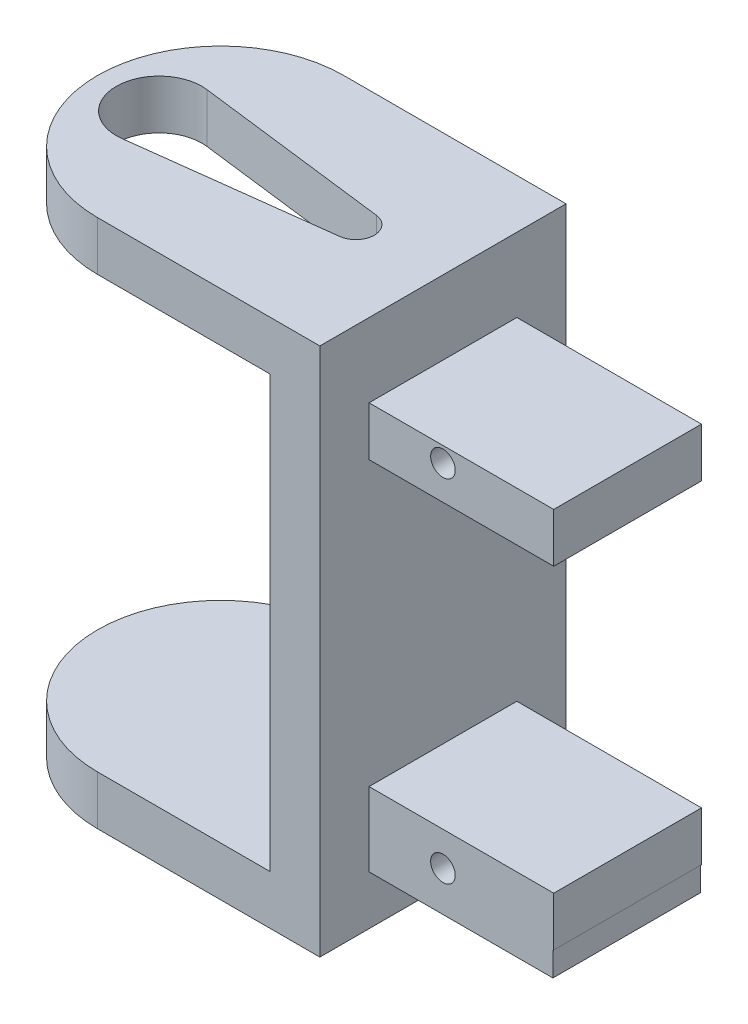
ISO-10303-21;
HEADER;
FILE_DESCRIPTION(('STEP AP214'),'2;1');
FILE_NAME('part.step','',(''),(''),'','','');
FILE_SCHEMA(('AUTOMOTIVE_DESIGN { 1 0 10303 214 1 1 1 1 }'));
ENDSEC;
DATA;
#1=APPLICATION_CONTEXT('core data for automotive mechanical design processes');
#2=APPLICATION_PROTOCOL_DEFINITION('international standard','automotive_design',2000,#1);
#3=PRODUCT_CONTEXT('',#1,'mechanical');
#4=PRODUCT('Part','Part','',(#3));
#5=PRODUCT_RELATED_PRODUCT_CATEGORY('part','',(#4));
#6=PRODUCT_DEFINITION_FORMATION('','',#4);
#7=PRODUCT_DEFINITION_CONTEXT('part definition',#1,'design');
#8=PRODUCT_DEFINITION('design','',#6,#7);
#9=PRODUCT_DEFINITION_SHAPE('','',#8);
#10=(LENGTH_UNIT() NAMED_UNIT(*) SI_UNIT(.MILLI.,.METRE.));
#11=(NAMED_UNIT(*) PLANE_ANGLE_UNIT() SI_UNIT($,.RADIAN.));
#12=(NAMED_UNIT(*) SI_UNIT($,.STERADIAN.) SOLID_ANGLE_UNIT());
#13=UNCERTAINTY_MEASURE_WITH_UNIT(LENGTH_MEASURE(1.E-05),#10,'distance_accuracy_value','');
#14=(GEOMETRIC_REPRESENTATION_CONTEXT(3) GLOBAL_UNCERTAINTY_ASSIGNED_CONTEXT((#13)) GLOBAL_UNIT_ASSIGNED_CONTEXT((#10,
#11,#12)) REPRESENTATION_CONTEXT('',''));
#15=CARTESIAN_POINT('',(0.,0.,0.));
#16=DIRECTION('',(0.,0.,1.));
#17=DIRECTION('',(1.,0.,0.));
#18=AXIS2_PLACEMENT_3D('',#15,#16,#17);
#19=CARTESIAN_POINT('',(28.0620864376926,0.,0.));
#20=DIRECTION('',(1.,0.,0.));
#21=DIRECTION('',(0.,1.,0.));
#22=AXIS2_PLACEMENT_3D('',#19,#20,#21);
#23=PLANE('',#22);
#24=DIRECTION('',(0.,0.,-1.));
#25=VECTOR('',#24,1.);
#26=CARTESIAN_POINT('',(28.0620864376926,-5.99999999999999,0.));
#27=LINE('',#26,#25);
#28=CARTESIAN_POINT('',(28.0620864376926,-5.99999999999999,16.0016515585464));
#29=VERTEX_POINT('',#28);
#30=CARTESIAN_POINT('',(28.0620864376926,-5.99999999999999,3.99834844145359));
#31=VERTEX_POINT('',#30);
#32=EDGE_CURVE('E239',#29,#31,#27,.T.);
#33=ORIENTED_EDGE('',*,*,#32,.T.);
#34=DIRECTION('',(0.,1.,0.));
#35=VECTOR('',#34,1.);
#36=CARTESIAN_POINT('',(28.0620864376926,0.,3.99834844145359));
#37=LINE('',#36,#35);
#38=CARTESIAN_POINT('',(28.0620864376926,-9.99999999999999,3.99834844145359));
#39=VERTEX_POINT('',#38);
#40=EDGE_CURVE('E244',#39,#31,#37,.T.);
#41=ORIENTED_EDGE('',*,*,#40,.F.);
#42=DIRECTION('',(0.,0.,-1.));
#43=VECTOR('',#42,1.);
#44=CARTESIAN_POINT('',(28.0620864376926,-9.99999999999999,0.));
#45=LINE('',#44,#43);
#46=CARTESIAN_POINT('',(28.0620864376926,-9.99999999999999,16.0016515585464));
#47=VERTEX_POINT('',#46);
#48=EDGE_CURVE('E257',#47,#39,#45,.T.);
#49=ORIENTED_EDGE('',*,*,#48,.F.);
#50=DIRECTION('',(0.,1.,0.));
#51=VECTOR('',#50,1.);
#52=CARTESIAN_POINT('',(28.0620864376926,0.,16.0016515585464));
#53=LINE('',#52,#51);
#54=EDGE_CURVE('E254',#47,#29,#53,.T.);
#55=ORIENTED_EDGE('',*,*,#54,.T.);
#56=EDGE_LOOP('',(#33,#41,#49,#55));
#57=FACE_BOUND('',#56,.T.);
#58=DIRECTION('',(0.,-1.,0.));
#59=VECTOR('',#58,1.);
#60=CARTESIAN_POINT('',(28.0620864376926,0.,20.));
#61=LINE('',#60,#59);
#62=CARTESIAN_POINT('',(28.0620864376926,0.,20.));
#63=VERTEX_POINT('',#62);
#64=CARTESIAN_POINT('',(28.0620864376926,-43.,20.));
#65=VERTEX_POINT('',#64);
#66=EDGE_CURVE('E291',#63,#65,#61,.T.);
#67=ORIENTED_EDGE('',*,*,#66,.T.);
#68=DIRECTION('',(0.,0.,-1.));
#69=VECTOR('',#68,1.);
#70=CARTESIAN_POINT('',(28.0620864376926,-43.,0.));
#71=LINE('',#70,#69);
#72=CARTESIAN_POINT('',(28.0620864376926,-43.,0.));
#73=VERTEX_POINT('',#72);
#74=EDGE_CURVE('E344',#65,#73,#71,.T.);
#75=ORIENTED_EDGE('',*,*,#74,.T.);
#76=DIRECTION('',(0.,1.,0.));
#77=VECTOR('',#76,1.);
#78=CARTESIAN_POINT('',(28.0620864376926,0.,0.));
#79=LINE('',#78,#77);
#80=CARTESIAN_POINT('',(28.0620864376926,0.,0.));
#81=VERTEX_POINT('',#80);
#82=EDGE_CURVE('E294',#73,#81,#79,.T.);
#83=ORIENTED_EDGE('',*,*,#82,.T.);
#84=DIRECTION('',(0.,0.,1.));
#85=VECTOR('',#84,1.);
#86=CARTESIAN_POINT('',(28.0620864376926,0.,20.));
#87=LINE('',#86,#85);
#88=EDGE_CURVE('E297',#81,#63,#87,.T.);
#89=ORIENTED_EDGE('',*,*,#88,.T.);
#90=EDGE_LOOP('',(#67,#75,#83,#89));
#91=FACE_BOUND('',#90,.T.);
#92=DIRECTION('',(0.,0.,-1.));
#93=VECTOR('',#92,1.);
#94=CARTESIAN_POINT('',(28.0620864376926,-39.,16.0016515585464));
#95=LINE('',#94,#93);
#96=CARTESIAN_POINT('',(28.0620864376926,-39.,16.0016515585464));
#97=VERTEX_POINT('',#96);
#98=CARTESIAN_POINT('',(28.0620864376926,-39.,3.99834844145358));
#99=VERTEX_POINT('',#98);
#100=EDGE_CURVE('E197',#97,#99,#95,.T.);
#101=ORIENTED_EDGE('',*,*,#100,.F.);
#102=DIRECTION('',(0.,-1.,0.));
#103=VECTOR('',#102,1.);
#104=CARTESIAN_POINT('',(28.0620864376926,0.,16.0016515585464));
#105=LINE('',#104,#103);
#106=CARTESIAN_POINT('',(28.0620864376926,-33.,16.0016515585464));
#107=VERTEX_POINT('',#106);
#108=EDGE_CURVE('E49',#107,#97,#105,.T.);
#109=ORIENTED_EDGE('',*,*,#108,.F.);
#110=DIRECTION('',(0.,0.,-1.));
#111=VECTOR('',#110,1.);
#112=CARTESIAN_POINT('',(28.0620864376926,-33.,0.));
#113=LINE('',#112,#111);
#114=CARTESIAN_POINT('',(28.0620864376926,-33.,3.99834844145358));
#115=VERTEX_POINT('',#114);
#116=EDGE_CURVE('E192',#107,#115,#113,.T.);
#117=ORIENTED_EDGE('',*,*,#116,.T.);
#118=DIRECTION('',(0.,-1.,0.));
#119=VECTOR('',#118,1.);
#120=CARTESIAN_POINT('',(28.0620864376926,0.,3.99834844145358));
#121=LINE('',#120,#119);
#122=EDGE_CURVE('E191',#115,#99,#121,.T.);
#123=ORIENTED_EDGE('',*,*,#122,.T.);
#124=EDGE_LOOP('',(#101,#109,#117,#123));
#125=FACE_BOUND('',#124,.T.);
#126=ADVANCED_FACE('F34',(#57,#91,#125),#23,.T.);
#127=CARTESIAN_POINT('',(43.0620864376926,-37.,0.));
#128=DIRECTION('',(0.,1.,0.));
#129=DIRECTION('',(-1.,0.,0.));
#130=AXIS2_PLACEMENT_3D('',#127,#128,#129);
#131=PLANE('',#130);
#132=DIRECTION('',(0.,0.,1.));
#133=VECTOR('',#132,1.);
#134=CARTESIAN_POINT('',(42.9967384028542,-37.,16.0016515585464));
#135=LINE('',#134,#133);
#136=CARTESIAN_POINT('',(42.9967384028542,-37.,3.99834844145358));
#137=VERTEX_POINT('',#136);
#138=CARTESIAN_POINT('',(42.9967384028542,-37.,16.0016515585464));
#139=VERTEX_POINT('',#138);
#140=EDGE_CURVE('E202',#137,#139,#135,.T.);
#141=ORIENTED_EDGE('',*,*,#140,.F.);
#142=DIRECTION('',(-1.,0.,0.));
#143=VECTOR('',#142,1.);
#144=CARTESIAN_POINT('',(43.0620864376926,-37.,3.99834844145358));
#145=LINE('',#144,#143);
#146=CARTESIAN_POINT('',(43.0620864376926,-37.,3.99834844145358));
#147=VERTEX_POINT('',#146);
#148=EDGE_CURVE('E232',#147,#137,#145,.T.);
#149=ORIENTED_EDGE('',*,*,#148,.F.);
#150=DIRECTION('',(0.,0.,-1.));
#151=VECTOR('',#150,1.);
#152=CARTESIAN_POINT('',(43.0620864376926,-37.,0.));
#153=LINE('',#152,#151);
#154=CARTESIAN_POINT('',(43.0620864376926,-37.,16.0016515585464));
#155=VERTEX_POINT('',#154);
#156=EDGE_CURVE('E222',#155,#147,#153,.T.);
#157=ORIENTED_EDGE('',*,*,#156,.F.);
#158=DIRECTION('',(-1.,0.,0.));
#159=VECTOR('',#158,1.);
#160=CARTESIAN_POINT('',(43.0620864376926,-37.,16.0016515585464));
#161=LINE('',#160,#159);
#162=EDGE_CURVE('E235',#155,#139,#161,.T.);
#163=ORIENTED_EDGE('',*,*,#162,.T.);
#164=EDGE_LOOP('',(#141,#149,#157,#163));
#165=FACE_BOUND('',#164,.T.);
#166=ADVANCED_FACE('F396',(#165),#131,.F.);
#167=CARTESIAN_POINT('',(0.,-4.,20.));
#168=DIRECTION('',(0.,1.,0.));
#169=DIRECTION('',(0.,0.,1.));
#170=AXIS2_PLACEMENT_3D('',#167,#168,#169);
#171=PLANE('',#170);
#172=CARTESIAN_POINT('',(5.,-4.,10.));
#173=DIRECTION('',(0.,1.,0.));
#174=DIRECTION('',(0.,0.,1.));
#175=AXIS2_PLACEMENT_3D('',#172,#173,#174);
#176=CIRCLE('',#175,3.475);
#177=CARTESIAN_POINT('',(5.42934782608696,-4.,6.55162568095712));
#178=VERTEX_POINT('',#177);
#179=CARTESIAN_POINT('',(5.42934782608696,-4.,13.4483743190429));
#180=VERTEX_POINT('',#179);
#181=EDGE_CURVE('E322',#178,#180,#176,.T.);
#182=ORIENTED_EDGE('',*,*,#181,.T.);
#183=DIRECTION('',(0.992337933537518,0.,-0.123553331248045));
#184=VECTOR('',#183,1.);
#185=CARTESIAN_POINT('',(-0.720391619724212,-4.,14.2140618627296));
#186=LINE('',#185,#184);
#187=CARTESIAN_POINT('',(21.1703299968721,-4.,11.4885069003063));
#188=VERTEX_POINT('',#187);
#189=EDGE_CURVE('E325',#180,#188,#186,.T.);
#190=ORIENTED_EDGE('',*,*,#189,.T.);
#191=CARTESIAN_POINT('',(20.985,-4.,10.));
#192=DIRECTION('',(0.,1.,0.));
#193=DIRECTION('',(-1.,0.,0.));
#194=AXIS2_PLACEMENT_3D('',#191,#192,#193);
#195=CIRCLE('',#194,1.5);
#196=CARTESIAN_POINT('',(21.1703299968721,-4.,8.51149309969372));
#197=VERTEX_POINT('',#196);
#198=EDGE_CURVE('E333',#197,#188,#195,.F.);
#199=ORIENTED_EDGE('',*,*,#198,.F.);
#200=DIRECTION('',(0.992337933537518,0.,0.123553331248045));
#201=VECTOR('',#200,1.);
#202=CARTESIAN_POINT('',(1.73174152852302,-4.,6.09124665052021));
#203=LINE('',#202,#201);
#204=EDGE_CURVE('E315',#178,#197,#203,.T.);
#205=ORIENTED_EDGE('',*,*,#204,.F.);
#206=EDGE_LOOP('',(#182,#190,#199,#205));
#207=FACE_BOUND('',#206,.T.);
#208=DIRECTION('',(1.,0.,0.));
#209=VECTOR('',#208,1.);
#210=CARTESIAN_POINT('',(0.,-4.,20.));
#211=LINE('',#210,#209);
#212=CARTESIAN_POINT('',(10.0000000000001,-4.00000000000002,20.));
#213=VERTEX_POINT('',#212);
#214=CARTESIAN_POINT('',(24.,-4.,20.));
#215=VERTEX_POINT('',#214);
#216=EDGE_CURVE('E328',#213,#215,#211,.T.);
#217=ORIENTED_EDGE('',*,*,#216,.F.);
#218=CARTESIAN_POINT('',(10.,-4.,10.));
#219=DIRECTION('',(0.,1.,0.));
#220=DIRECTION('',(0.,0.,1.));
#221=AXIS2_PLACEMENT_3D('',#218,#219,#220);
#222=CIRCLE('',#221,10.0000000000001);
#223=CARTESIAN_POINT('',(10.,-4.00000000000001,0.));
#224=VERTEX_POINT('',#223);
#225=EDGE_CURVE('E274',#224,#213,#222,.T.);
#226=ORIENTED_EDGE('',*,*,#225,.F.);
#227=DIRECTION('',(1.,0.,0.));
#228=VECTOR('',#227,1.);
#229=CARTESIAN_POINT('',(0.,-4.,0.));
#230=LINE('',#229,#228);
#231=CARTESIAN_POINT('',(24.,-4.,0.));
#232=VERTEX_POINT('',#231);
#233=EDGE_CURVE('E327',#224,#232,#230,.T.);
#234=ORIENTED_EDGE('',*,*,#233,.T.);
#235=DIRECTION('',(0.,0.,1.));
#236=VECTOR('',#235,1.);
#237=CARTESIAN_POINT('',(24.,-4.,-3.));
#238=LINE('',#237,#236);
#239=EDGE_CURVE('E288',#232,#215,#238,.T.);
#240=ORIENTED_EDGE('',*,*,#239,.T.);
#241=EDGE_LOOP('',(#217,#226,#234,#240));
#242=FACE_BOUND('',#241,.T.);
#243=ADVANCED_FACE('F36',(#207,#242),#171,.F.);
#244=CARTESIAN_POINT('',(0.,0.,20.));
#245=DIRECTION('',(0.,1.,0.));
#246=DIRECTION('',(0.,0.,1.));
#247=AXIS2_PLACEMENT_3D('',#244,#245,#246);
#248=PLANE('',#247);
#249=DIRECTION('',(0.992337933537518,0.,-0.123553331248045));
#250=VECTOR('',#249,1.);
#251=CARTESIAN_POINT('',(1.73174152852302,0.,13.9087533494798));
#252=LINE('',#251,#250);
#253=CARTESIAN_POINT('',(5.42934782608696,0.,13.4483743190429));
#254=VERTEX_POINT('',#253);
#255=CARTESIAN_POINT('',(21.1703299968721,0.,11.4885069003063));
#256=VERTEX_POINT('',#255);
#257=EDGE_CURVE('E300',#254,#256,#252,.T.);
#258=ORIENTED_EDGE('',*,*,#257,.F.);
#259=CARTESIAN_POINT('',(5.,0.,10.));
#260=DIRECTION('',(0.,1.,0.));
#261=DIRECTION('',(0.,0.,1.));
#262=AXIS2_PLACEMENT_3D('',#259,#260,#261);
#263=CIRCLE('',#262,3.475);
#264=CARTESIAN_POINT('',(5.42934782608696,0.,6.55162568095712));
#265=VERTEX_POINT('',#264);
#266=EDGE_CURVE('E309',#265,#254,#263,.T.);
#267=ORIENTED_EDGE('',*,*,#266,.F.);
#268=DIRECTION('',(0.992337933537518,0.,0.123553331248045));
#269=VECTOR('',#268,1.);
#270=CARTESIAN_POINT('',(-0.720391619724212,0.,5.78593813727043));
#271=LINE('',#270,#269);
#272=CARTESIAN_POINT('',(21.1703299968721,0.,8.51149309969372));
#273=VERTEX_POINT('',#272);
#274=EDGE_CURVE('E306',#265,#273,#271,.T.);
#275=ORIENTED_EDGE('',*,*,#274,.T.);
#276=CARTESIAN_POINT('',(20.985,0.,10.));
#277=DIRECTION('',(0.,1.,0.));
#278=DIRECTION('',(0.,0.,1.));
#279=AXIS2_PLACEMENT_3D('',#276,#277,#278);
#280=CIRCLE('',#279,1.5);
#281=EDGE_CURVE('E303',#256,#273,#280,.T.);
#282=ORIENTED_EDGE('',*,*,#281,.F.);
#283=EDGE_LOOP('',(#258,#267,#275,#282));
#284=FACE_BOUND('',#283,.T.);
#285=CARTESIAN_POINT('',(10.,0.,10.));
#286=DIRECTION('',(0.,1.,0.));
#287=DIRECTION('',(0.,0.,1.));
#288=AXIS2_PLACEMENT_3D('',#285,#286,#287);
#289=CIRCLE('',#288,10.0000000000001);
#290=CARTESIAN_POINT('',(10.,0.,0.));
#291=VERTEX_POINT('',#290);
#292=CARTESIAN_POINT('',(10.0000000000001,0.,20.));
#293=VERTEX_POINT('',#292);
#294=EDGE_CURVE('E266',#291,#293,#289,.T.);
#295=ORIENTED_EDGE('',*,*,#294,.T.);
#296=DIRECTION('',(1.,0.,0.));
#297=VECTOR('',#296,1.);
#298=CARTESIAN_POINT('',(0.,0.,20.));
#299=LINE('',#298,#297);
#300=EDGE_CURVE('E330',#293,#63,#299,.T.);
#301=ORIENTED_EDGE('',*,*,#300,.T.);
#302=ORIENTED_EDGE('',*,*,#88,.F.);
#303=DIRECTION('',(1.,0.,0.));
#304=VECTOR('',#303,1.);
#305=CARTESIAN_POINT('',(0.,0.,0.));
#306=LINE('',#305,#304);
#307=EDGE_CURVE('E331',#291,#81,#306,.T.);
#308=ORIENTED_EDGE('',*,*,#307,.F.);
#309=EDGE_LOOP('',(#295,#301,#302,#308));
#310=FACE_BOUND('',#309,.T.);
#311=ADVANCED_FACE('F364',(#284,#310),#248,.T.);
#312=CARTESIAN_POINT('',(0.,-39.,0.));
#313=DIRECTION('',(0.,-1.,0.));
#314=DIRECTION('',(0.,0.,-1.));
#315=AXIS2_PLACEMENT_3D('',#312,#313,#314);
#316=PLANE('',#315);
#317=CARTESIAN_POINT('',(10.,-39.,10.));
#318=DIRECTION('',(0.,-1.,0.));
#319=DIRECTION('',(0.,0.,-1.));
#320=AXIS2_PLACEMENT_3D('',#317,#318,#319);
#321=CIRCLE('',#320,10.0000000000001);
#322=CARTESIAN_POINT('',(10.0000000000001,-39.,20.));
#323=VERTEX_POINT('',#322);
#324=CARTESIAN_POINT('',(10.,-39.,0.));
#325=VERTEX_POINT('',#324);
#326=EDGE_CURVE('E272',#323,#325,#321,.T.);
#327=ORIENTED_EDGE('',*,*,#326,.F.);
#328=DIRECTION('',(1.,0.,0.));
#329=VECTOR('',#328,1.);
#330=CARTESIAN_POINT('',(0.,-39.,20.));
#331=LINE('',#330,#329);
#332=CARTESIAN_POINT('',(24.,-39.,20.));
#333=VERTEX_POINT('',#332);
#334=EDGE_CURVE('E283',#323,#333,#331,.T.);
#335=ORIENTED_EDGE('',*,*,#334,.T.);
#336=DIRECTION('',(0.,0.,-1.));
#337=VECTOR('',#336,1.);
#338=CARTESIAN_POINT('',(24.,-39.,-3.));
#339=LINE('',#338,#337);
#340=CARTESIAN_POINT('',(24.,-39.,0.));
#341=VERTEX_POINT('',#340);
#342=EDGE_CURVE('E341',#333,#341,#339,.T.);
#343=ORIENTED_EDGE('',*,*,#342,.T.);
#344=DIRECTION('',(-1.,0.,0.));
#345=VECTOR('',#344,1.);
#346=CARTESIAN_POINT('',(0.,-39.,0.));
#347=LINE('',#346,#345);
#348=EDGE_CURVE('E280',#341,#325,#347,.T.);
#349=ORIENTED_EDGE('',*,*,#348,.T.);
#350=EDGE_LOOP('',(#327,#335,#343,#349));
#351=FACE_BOUND('',#350,.T.);
#352=ADVANCED_FACE('F382',(#351),#316,.F.);
#353=CARTESIAN_POINT('',(0.,-43.,-30.));
#354=DIRECTION('',(0.,-1.,0.));
#355=DIRECTION('',(0.,0.,-1.));
#356=AXIS2_PLACEMENT_3D('',#353,#354,#355);
#357=PLANE('',#356);
#358=DIRECTION('',(1.,0.,0.));
#359=VECTOR('',#358,1.);
#360=CARTESIAN_POINT('',(0.,-43.,20.));
#361=LINE('',#360,#359);
#362=CARTESIAN_POINT('',(10.0000000000001,-43.,20.));
#363=VERTEX_POINT('',#362);
#364=EDGE_CURVE('E276',#363,#65,#361,.T.);
#365=ORIENTED_EDGE('',*,*,#364,.F.);
#366=CARTESIAN_POINT('',(10.,-43.,10.));
#367=DIRECTION('',(0.,-1.,0.));
#368=DIRECTION('',(0.,0.,-1.));
#369=AXIS2_PLACEMENT_3D('',#366,#367,#368);
#370=CIRCLE('',#369,10.0000000000001);
#371=CARTESIAN_POINT('',(10.,-43.,0.));
#372=VERTEX_POINT('',#371);
#373=EDGE_CURVE('E346',#363,#372,#370,.T.);
#374=ORIENTED_EDGE('',*,*,#373,.T.);
#375=DIRECTION('',(1.,0.,0.));
#376=VECTOR('',#375,1.);
#377=CARTESIAN_POINT('',(0.,-43.,0.));
#378=LINE('',#377,#376);
#379=EDGE_CURVE('E278',#372,#73,#378,.T.);
#380=ORIENTED_EDGE('',*,*,#379,.T.);
#381=ORIENTED_EDGE('',*,*,#74,.F.);
#382=EDGE_LOOP('',(#365,#374,#380,#381));
#383=FACE_BOUND('',#382,.T.);
#384=ADVANCED_FACE('F385',(#383),#357,.T.);
#385=CARTESIAN_POINT('',(0.,0.,20.));
#386=DIRECTION('',(0.,0.,1.));
#387=DIRECTION('',(1.,0.,0.));
#388=AXIS2_PLACEMENT_3D('',#385,#386,#387);
#389=PLANE('',#388);
#390=DIRECTION('',(0.,1.,0.));
#391=VECTOR('',#390,1.);
#392=CARTESIAN_POINT('',(10.,-50.,20.));
#393=LINE('',#392,#391);
#394=EDGE_CURVE('E11',#363,#323,#393,.T.);
#395=ORIENTED_EDGE('',*,*,#394,.F.);
#396=ORIENTED_EDGE('',*,*,#364,.T.);
#397=ORIENTED_EDGE('',*,*,#66,.F.);
#398=ORIENTED_EDGE('',*,*,#300,.F.);
#399=EDGE_CURVE('E38',#213,#293,#393,.T.);
#400=ORIENTED_EDGE('',*,*,#399,.F.);
#401=ORIENTED_EDGE('',*,*,#216,.T.);
#402=DIRECTION('',(0.,1.,0.));
#403=VECTOR('',#402,1.);
#404=CARTESIAN_POINT('',(24.,-4.,20.));
#405=LINE('',#404,#403);
#406=EDGE_CURVE('E285',#333,#215,#405,.T.);
#407=ORIENTED_EDGE('',*,*,#406,.F.);
#408=ORIENTED_EDGE('',*,*,#334,.F.);
#409=EDGE_LOOP('',(#395,#396,#397,#398,#400,#401,#407,#408));
#410=FACE_BOUND('',#409,.T.);
#411=ADVANCED_FACE('F361',(#410),#389,.T.);
#412=CARTESIAN_POINT('',(0.,0.,0.));
#413=DIRECTION('',(0.,0.,1.));
#414=DIRECTION('',(1.,0.,0.));
#415=AXIS2_PLACEMENT_3D('',#412,#413,#414);
#416=PLANE('',#415);
#417=ORIENTED_EDGE('',*,*,#379,.F.);
#418=DIRECTION('',(0.,1.,0.));
#419=VECTOR('',#418,1.);
#420=CARTESIAN_POINT('',(10.,-50.,0.));
#421=LINE('',#420,#419);
#422=EDGE_CURVE('E271',#372,#325,#421,.T.);
#423=ORIENTED_EDGE('',*,*,#422,.T.);
#424=ORIENTED_EDGE('',*,*,#348,.F.);
#425=DIRECTION('',(0.,1.,0.));
#426=VECTOR('',#425,1.);
#427=CARTESIAN_POINT('',(24.,0.,0.));
#428=LINE('',#427,#426);
#429=EDGE_CURVE('E338',#341,#232,#428,.T.);
#430=ORIENTED_EDGE('',*,*,#429,.T.);
#431=ORIENTED_EDGE('',*,*,#233,.F.);
#432=EDGE_CURVE('E268',#224,#291,#421,.T.);
#433=ORIENTED_EDGE('',*,*,#432,.T.);
#434=ORIENTED_EDGE('',*,*,#307,.T.);
#435=ORIENTED_EDGE('',*,*,#82,.F.);
#436=EDGE_LOOP('',(#417,#423,#424,#430,#431,#433,#434,#435));
#437=FACE_BOUND('',#436,.T.);
#438=ADVANCED_FACE('F370',(#437),#416,.F.);
#439=CARTESIAN_POINT('',(24.,-4.,-3.));
#440=DIRECTION('',(1.,0.,0.));
#441=DIRECTION('',(0.,1.,0.));
#442=AXIS2_PLACEMENT_3D('',#439,#440,#441);
#443=PLANE('',#442);
#444=ORIENTED_EDGE('',*,*,#342,.F.);
#445=ORIENTED_EDGE('',*,*,#406,.T.);
#446=ORIENTED_EDGE('',*,*,#239,.F.);
#447=ORIENTED_EDGE('',*,*,#429,.F.);
#448=EDGE_LOOP('',(#444,#445,#446,#447));
#449=FACE_BOUND('',#448,.T.);
#450=ADVANCED_FACE('F379',(#449),#443,.F.);
#451=CARTESIAN_POINT('',(1.73174152852302,-20.,13.9087533494798));
#452=DIRECTION('',(0.123553331248045,0.,0.992337933537518));
#453=DIRECTION('',(0.992337933537518,0.,-0.123553331248045));
#454=AXIS2_PLACEMENT_3D('',#451,#452,#453);
#455=PLANE('',#454);
#456=DIRECTION('',(0.,1.,0.));
#457=VECTOR('',#456,1.);
#458=CARTESIAN_POINT('',(21.1703299968721,-20.,11.4885069003063));
#459=LINE('',#458,#457);
#460=EDGE_CURVE('E312',#188,#256,#459,.T.);
#461=ORIENTED_EDGE('',*,*,#460,.F.);
#462=ORIENTED_EDGE('',*,*,#189,.F.);
#463=DIRECTION('',(0.,1.,0.));
#464=VECTOR('',#463,1.);
#465=CARTESIAN_POINT('',(5.42934782608696,-20.,13.4483743190429));
#466=LINE('',#465,#464);
#467=EDGE_CURVE('E313',#180,#254,#466,.T.);
#468=ORIENTED_EDGE('',*,*,#467,.T.);
#469=ORIENTED_EDGE('',*,*,#257,.T.);
#470=EDGE_LOOP('',(#461,#462,#468,#469));
#471=FACE_BOUND('',#470,.T.);
#472=ADVANCED_FACE('F410',(#471),#455,.F.);
#473=CARTESIAN_POINT('',(5.,-20.,10.));
#474=DIRECTION('',(0.,1.,0.));
#475=DIRECTION('',(0.,0.,1.));
#476=AXIS2_PLACEMENT_3D('',#473,#474,#475);
#477=CYLINDRICAL_SURFACE('',#476,3.475);
#478=DIRECTION('',(0.,1.,0.));
#479=VECTOR('',#478,1.);
#480=CARTESIAN_POINT('',(5.42934782608696,-20.,6.55162568095712));
#481=LINE('',#480,#479);
#482=EDGE_CURVE('E316',#178,#265,#481,.T.);
#483=ORIENTED_EDGE('',*,*,#482,.T.);
#484=ORIENTED_EDGE('',*,*,#266,.T.);
#485=ORIENTED_EDGE('',*,*,#467,.F.);
#486=ORIENTED_EDGE('',*,*,#181,.F.);
#487=EDGE_LOOP('',(#483,#484,#485,#486));
#488=FACE_BOUND('',#487,.T.);
#489=ADVANCED_FACE('F406',(#488),#477,.F.);
#490=CARTESIAN_POINT('',(-0.720391619724212,-20.,5.78593813727043));
#491=DIRECTION('',(-0.123553331248045,0.,0.992337933537518));
#492=DIRECTION('',(0.992337933537518,0.,0.123553331248045));
#493=AXIS2_PLACEMENT_3D('',#490,#491,#492);
#494=PLANE('',#493);
#495=ORIENTED_EDGE('',*,*,#204,.T.);
#496=DIRECTION('',(0.,1.,0.));
#497=VECTOR('',#496,1.);
#498=CARTESIAN_POINT('',(21.1703299968721,-20.,8.51149309969372));
#499=LINE('',#498,#497);
#500=EDGE_CURVE('E318',#197,#273,#499,.T.);
#501=ORIENTED_EDGE('',*,*,#500,.T.);
#502=ORIENTED_EDGE('',*,*,#274,.F.);
#503=ORIENTED_EDGE('',*,*,#482,.F.);
#504=EDGE_LOOP('',(#495,#501,#502,#503));
#505=FACE_BOUND('',#504,.T.);
#506=ADVANCED_FACE('F409',(#505),#494,.T.);
#507=CARTESIAN_POINT('',(20.985,-20.,10.));
#508=DIRECTION('',(0.,1.,0.));
#509=DIRECTION('',(0.,0.,1.));
#510=AXIS2_PLACEMENT_3D('',#507,#508,#509);
#511=CYLINDRICAL_SURFACE('',#510,1.5);
#512=ORIENTED_EDGE('',*,*,#500,.F.);
#513=ORIENTED_EDGE('',*,*,#198,.T.);
#514=ORIENTED_EDGE('',*,*,#460,.T.);
#515=ORIENTED_EDGE('',*,*,#281,.T.);
#516=EDGE_LOOP('',(#512,#513,#514,#515));
#517=FACE_BOUND('',#516,.T.);
#518=ADVANCED_FACE('F414',(#517),#511,.F.);
#519=CARTESIAN_POINT('',(10.,-50.,10.));
#520=DIRECTION('',(0.,1.,0.));
#521=DIRECTION('',(0.,0.,1.));
#522=AXIS2_PLACEMENT_3D('',#519,#520,#521);
#523=CYLINDRICAL_SURFACE('',#522,10.0000000000001);
#524=ORIENTED_EDGE('',*,*,#326,.T.);
#525=ORIENTED_EDGE('',*,*,#422,.F.);
#526=ORIENTED_EDGE('',*,*,#373,.F.);
#527=ORIENTED_EDGE('',*,*,#394,.T.);
#528=EDGE_LOOP('',(#524,#525,#526,#527));
#529=FACE_BOUND('',#528,.T.);
#530=ADVANCED_FACE('F384',(#529),#523,.T.);
#531=ORIENTED_EDGE('',*,*,#225,.T.);
#532=ORIENTED_EDGE('',*,*,#399,.T.);
#533=ORIENTED_EDGE('',*,*,#294,.F.);
#534=ORIENTED_EDGE('',*,*,#432,.F.);
#535=EDGE_LOOP('',(#531,#532,#533,#534));
#536=FACE_BOUND('',#535,.T.);
#537=ADVANCED_FACE('F355',(#536),#523,.T.);
#538=CARTESIAN_POINT('',(43.0620864376926,-5.99999999999999,0.));
#539=DIRECTION('',(0.,1.,0.));
#540=DIRECTION('',(-1.,0.,0.));
#541=AXIS2_PLACEMENT_3D('',#538,#539,#540);
#542=PLANE('',#541);
#543=ORIENTED_EDGE('',*,*,#32,.F.);
#544=DIRECTION('',(-1.,0.,0.));
#545=VECTOR('',#544,1.);
#546=CARTESIAN_POINT('',(43.0620864376926,-5.99999999999999,16.0016515585464));
#547=LINE('',#546,#545);
#548=CARTESIAN_POINT('',(43.0620864376926,-5.99999999999999,16.0016515585464));
#549=VERTEX_POINT('',#548);
#550=EDGE_CURVE('E264',#549,#29,#547,.T.);
#551=ORIENTED_EDGE('',*,*,#550,.F.);
#552=DIRECTION('',(0.,0.,-1.));
#553=VECTOR('',#552,1.);
#554=CARTESIAN_POINT('',(43.0620864376926,-5.99999999999999,0.));
#555=LINE('',#554,#553);
#556=CARTESIAN_POINT('',(43.0620864376926,-5.99999999999999,3.99834844145359));
#557=VERTEX_POINT('',#556);
#558=EDGE_CURVE('E240',#549,#557,#555,.T.);
#559=ORIENTED_EDGE('',*,*,#558,.T.);
#560=DIRECTION('',(-1.,0.,0.));
#561=VECTOR('',#560,1.);
#562=CARTESIAN_POINT('',(43.0620864376926,-5.99999999999999,3.99834844145359));
#563=LINE('',#562,#561);
#564=EDGE_CURVE('E251',#557,#31,#563,.T.);
#565=ORIENTED_EDGE('',*,*,#564,.T.);
#566=EDGE_LOOP('',(#543,#551,#559,#565));
#567=FACE_BOUND('',#566,.T.);
#568=ADVANCED_FACE('F497',(#567),#542,.T.);
#569=CARTESIAN_POINT('',(43.0620864376926,0.,16.0016515585464));
#570=DIRECTION('',(0.,0.,1.));
#571=DIRECTION('',(1.,0.,0.));
#572=AXIS2_PLACEMENT_3D('',#569,#570,#571);
#573=PLANE('',#572);
#574=CARTESIAN_POINT('',(34.0620864376926,-7.25,16.0016515585464));
#575=DIRECTION('',(0.,0.,1.));
#576=DIRECTION('',(1.,0.,0.));
#577=AXIS2_PLACEMENT_3D('',#574,#575,#576);
#578=CIRCLE('',#577,0.999999999999998);
#579=CARTESIAN_POINT('',(35.0620864376926,-7.25,16.0016515585464));
#580=VERTEX_POINT('',#579);
#581=EDGE_CURVE('E730',#580,#580,#578,.T.);
#582=ORIENTED_EDGE('',*,*,#581,.F.);
#583=EDGE_LOOP('',(#582));
#584=FACE_BOUND('',#583,.T.);
#585=ORIENTED_EDGE('',*,*,#54,.F.);
#586=DIRECTION('',(-1.,0.,0.));
#587=VECTOR('',#586,1.);
#588=CARTESIAN_POINT('',(43.0620864376926,-9.99999999999999,16.0016515585464));
#589=LINE('',#588,#587);
#590=CARTESIAN_POINT('',(43.0620864376926,-9.99999999999999,16.0016515585464));
#591=VERTEX_POINT('',#590);
#592=EDGE_CURVE('E262',#591,#47,#589,.T.);
#593=ORIENTED_EDGE('',*,*,#592,.F.);
#594=DIRECTION('',(0.,1.,0.));
#595=VECTOR('',#594,1.);
#596=CARTESIAN_POINT('',(43.0620864376926,0.,16.0016515585464));
#597=LINE('',#596,#595);
#598=EDGE_CURVE('E243',#591,#549,#597,.T.);
#599=ORIENTED_EDGE('',*,*,#598,.T.);
#600=ORIENTED_EDGE('',*,*,#550,.T.);
#601=EDGE_LOOP('',(#585,#593,#599,#600));
#602=FACE_BOUND('',#601,.T.);
#603=ADVANCED_FACE('F491',(#584,#602),#573,.T.);
#604=CARTESIAN_POINT('',(43.0620864376926,-9.99999999999999,0.));
#605=DIRECTION('',(0.,1.,0.));
#606=DIRECTION('',(-1.,0.,0.));
#607=AXIS2_PLACEMENT_3D('',#604,#605,#606);
#608=PLANE('',#607);
#609=ORIENTED_EDGE('',*,*,#48,.T.);
#610=DIRECTION('',(-1.,0.,0.));
#611=VECTOR('',#610,1.);
#612=CARTESIAN_POINT('',(43.0620864376926,-9.99999999999999,3.99834844145359));
#613=LINE('',#612,#611);
#614=CARTESIAN_POINT('',(43.0620864376926,-9.99999999999999,3.99834844145359));
#615=VERTEX_POINT('',#614);
#616=EDGE_CURVE('E57',#615,#39,#613,.T.);
#617=ORIENTED_EDGE('',*,*,#616,.F.);
#618=DIRECTION('',(0.,0.,-1.));
#619=VECTOR('',#618,1.);
#620=CARTESIAN_POINT('',(43.0620864376926,-9.99999999999999,0.));
#621=LINE('',#620,#619);
#622=EDGE_CURVE('E247',#591,#615,#621,.T.);
#623=ORIENTED_EDGE('',*,*,#622,.F.);
#624=ORIENTED_EDGE('',*,*,#592,.T.);
#625=EDGE_LOOP('',(#609,#617,#623,#624));
#626=FACE_BOUND('',#625,.T.);
#627=ADVANCED_FACE('F496',(#626),#608,.F.);
#628=CARTESIAN_POINT('',(43.0620864376926,0.,3.99834844145359));
#629=DIRECTION('',(0.,0.,1.));
#630=DIRECTION('',(1.,0.,0.));
#631=AXIS2_PLACEMENT_3D('',#628,#629,#630);
#632=PLANE('',#631);
#633=ORIENTED_EDGE('',*,*,#40,.T.);
#634=ORIENTED_EDGE('',*,*,#564,.F.);
#635=DIRECTION('',(0.,1.,0.));
#636=VECTOR('',#635,1.);
#637=CARTESIAN_POINT('',(43.0620864376926,0.,3.99834844145359));
#638=LINE('',#637,#636);
#639=EDGE_CURVE('E249',#615,#557,#638,.T.);
#640=ORIENTED_EDGE('',*,*,#639,.F.);
#641=ORIENTED_EDGE('',*,*,#616,.T.);
#642=EDGE_LOOP('',(#633,#634,#640,#641));
#643=FACE_BOUND('',#642,.T.);
#644=ADVANCED_FACE('F562',(#643),#632,.F.);
#645=CARTESIAN_POINT('',(43.0620864376926,0.,0.));
#646=DIRECTION('',(1.,0.,0.));
#647=DIRECTION('',(0.,1.,0.));
#648=AXIS2_PLACEMENT_3D('',#645,#646,#647);
#649=PLANE('',#648);
#650=ORIENTED_EDGE('',*,*,#558,.F.);
#651=ORIENTED_EDGE('',*,*,#598,.F.);
#652=ORIENTED_EDGE('',*,*,#622,.T.);
#653=ORIENTED_EDGE('',*,*,#639,.T.);
#654=EDGE_LOOP('',(#650,#651,#652,#653));
#655=FACE_BOUND('',#654,.T.);
#656=ADVANCED_FACE('F558',(#655),#649,.T.);
#657=CARTESIAN_POINT('',(43.0620864376926,-33.,0.));
#658=DIRECTION('',(0.,1.,0.));
#659=DIRECTION('',(-1.,0.,0.));
#660=AXIS2_PLACEMENT_3D('',#657,#658,#659);
#661=PLANE('',#660);
#662=ORIENTED_EDGE('',*,*,#116,.F.);
#663=DIRECTION('',(-1.,0.,0.));
#664=VECTOR('',#663,1.);
#665=CARTESIAN_POINT('',(43.0620864376926,-33.,16.0016515585464));
#666=LINE('',#665,#664);
#667=CARTESIAN_POINT('',(43.0620864376926,-33.,16.0016515585464));
#668=VERTEX_POINT('',#667);
#669=EDGE_CURVE('E189',#668,#107,#666,.T.);
#670=ORIENTED_EDGE('',*,*,#669,.F.);
#671=DIRECTION('',(0.,0.,-1.));
#672=VECTOR('',#671,1.);
#673=CARTESIAN_POINT('',(43.0620864376926,-33.,0.));
#674=LINE('',#673,#672);
#675=CARTESIAN_POINT('',(43.0620864376926,-33.,3.99834844145358));
#676=VERTEX_POINT('',#675);
#677=EDGE_CURVE('E217',#668,#676,#674,.T.);
#678=ORIENTED_EDGE('',*,*,#677,.T.);
#679=DIRECTION('',(-1.,0.,0.));
#680=VECTOR('',#679,1.);
#681=CARTESIAN_POINT('',(43.0620864376926,-33.,3.99834844145358));
#682=LINE('',#681,#680);
#683=EDGE_CURVE('E227',#676,#115,#682,.T.);
#684=ORIENTED_EDGE('',*,*,#683,.T.);
#685=EDGE_LOOP('',(#662,#670,#678,#684));
#686=FACE_BOUND('',#685,.T.);
#687=ADVANCED_FACE('F509',(#686),#661,.T.);
#688=CARTESIAN_POINT('',(43.0620864376926,0.,16.0016515585464));
#689=DIRECTION('',(0.,0.,-1.));
#690=DIRECTION('',(-1.,0.,0.));
#691=AXIS2_PLACEMENT_3D('',#688,#689,#690);
#692=PLANE('',#691);
#693=CARTESIAN_POINT('',(34.0620864376926,-35.75,16.0016515585464));
#694=DIRECTION('',(0.,0.,1.));
#695=DIRECTION('',(1.,0.,0.));
#696=AXIS2_PLACEMENT_3D('',#693,#694,#695);
#697=CIRCLE('',#696,0.999999999999998);
#698=CARTESIAN_POINT('',(35.0620864376926,-35.75,16.0016515585464));
#699=VERTEX_POINT('',#698);
#700=EDGE_CURVE('E737',#699,#699,#697,.T.);
#701=ORIENTED_EDGE('',*,*,#700,.F.);
#702=EDGE_LOOP('',(#701));
#703=FACE_BOUND('',#702,.T.);
#704=ORIENTED_EDGE('',*,*,#108,.T.);
#705=DIRECTION('',(-1.,0.,0.));
#706=VECTOR('',#705,1.);
#707=CARTESIAN_POINT('',(28.0620864376926,-39.,16.0016515585464));
#708=LINE('',#707,#706);
#709=CARTESIAN_POINT('',(42.9967384028542,-39.,16.0016515585464));
#710=VERTEX_POINT('',#709);
#711=EDGE_CURVE('E187',#710,#97,#708,.T.);
#712=ORIENTED_EDGE('',*,*,#711,.F.);
#713=DIRECTION('',(0.,1.,0.));
#714=VECTOR('',#713,1.);
#715=CARTESIAN_POINT('',(42.9967384028542,-39.,16.0016515585464));
#716=LINE('',#715,#714);
#717=EDGE_CURVE('E211',#710,#139,#716,.T.);
#718=ORIENTED_EDGE('',*,*,#717,.T.);
#719=ORIENTED_EDGE('',*,*,#162,.F.);
#720=DIRECTION('',(0.,-1.,0.));
#721=VECTOR('',#720,1.);
#722=CARTESIAN_POINT('',(43.0620864376926,0.,16.0016515585464));
#723=LINE('',#722,#721);
#724=EDGE_CURVE('E220',#668,#155,#723,.T.);
#725=ORIENTED_EDGE('',*,*,#724,.F.);
#726=ORIENTED_EDGE('',*,*,#669,.T.);
#727=EDGE_LOOP('',(#704,#712,#718,#719,#725,#726));
#728=FACE_BOUND('',#727,.T.);
#729=ADVANCED_FACE('F185',(#703,#728),#692,.F.);
#730=CARTESIAN_POINT('',(43.0620864376926,0.,3.99834844145358));
#731=DIRECTION('',(0.,0.,-1.));
#732=DIRECTION('',(-1.,0.,0.));
#733=AXIS2_PLACEMENT_3D('',#730,#731,#732);
#734=PLANE('',#733);
#735=ORIENTED_EDGE('',*,*,#122,.F.);
#736=ORIENTED_EDGE('',*,*,#683,.F.);
#737=DIRECTION('',(0.,-1.,0.));
#738=VECTOR('',#737,1.);
#739=CARTESIAN_POINT('',(43.0620864376926,0.,3.99834844145358));
#740=LINE('',#739,#738);
#741=EDGE_CURVE('E224',#676,#147,#740,.T.);
#742=ORIENTED_EDGE('',*,*,#741,.T.);
#743=ORIENTED_EDGE('',*,*,#148,.T.);
#744=DIRECTION('',(0.,1.,0.));
#745=VECTOR('',#744,1.);
#746=CARTESIAN_POINT('',(42.9967384028542,-39.,3.99834844145358));
#747=LINE('',#746,#745);
#748=CARTESIAN_POINT('',(42.9967384028542,-39.,3.99834844145358));
#749=VERTEX_POINT('',#748);
#750=EDGE_CURVE('E215',#749,#137,#747,.T.);
#751=ORIENTED_EDGE('',*,*,#750,.F.);
#752=DIRECTION('',(1.,0.,0.));
#753=VECTOR('',#752,1.);
#754=CARTESIAN_POINT('',(28.0620864376926,-39.,3.99834844145358));
#755=LINE('',#754,#753);
#756=EDGE_CURVE('E205',#99,#749,#755,.T.);
#757=ORIENTED_EDGE('',*,*,#756,.F.);
#758=EDGE_LOOP('',(#735,#736,#742,#743,#751,#757));
#759=FACE_BOUND('',#758,.T.);
#760=ADVANCED_FACE('F455',(#759),#734,.T.);
#761=CARTESIAN_POINT('',(43.0620864376926,0.,0.));
#762=DIRECTION('',(1.,0.,0.));
#763=DIRECTION('',(0.,1.,0.));
#764=AXIS2_PLACEMENT_3D('',#761,#762,#763);
#765=PLANE('',#764);
#766=ORIENTED_EDGE('',*,*,#677,.F.);
#767=ORIENTED_EDGE('',*,*,#724,.T.);
#768=ORIENTED_EDGE('',*,*,#156,.T.);
#769=ORIENTED_EDGE('',*,*,#741,.F.);
#770=EDGE_LOOP('',(#766,#767,#768,#769));
#771=FACE_BOUND('',#770,.T.);
#772=ADVANCED_FACE('F460',(#771),#765,.T.);
#773=CARTESIAN_POINT('',(42.9967384028542,-39.,16.0016515585464));
#774=DIRECTION('',(-1.,0.,0.));
#775=DIRECTION('',(0.,-1.,0.));
#776=AXIS2_PLACEMENT_3D('',#773,#774,#775);
#777=PLANE('',#776);
#778=ORIENTED_EDGE('',*,*,#140,.T.);
#779=ORIENTED_EDGE('',*,*,#717,.F.);
#780=DIRECTION('',(0.,0.,1.));
#781=VECTOR('',#780,1.);
#782=CARTESIAN_POINT('',(42.9967384028542,-39.,16.0016515585464));
#783=LINE('',#782,#781);
#784=EDGE_CURVE('E200',#749,#710,#783,.T.);
#785=ORIENTED_EDGE('',*,*,#784,.F.);
#786=ORIENTED_EDGE('',*,*,#750,.T.);
#787=EDGE_LOOP('',(#778,#779,#785,#786));
#788=FACE_BOUND('',#787,.T.);
#789=ADVANCED_FACE('F471',(#788),#777,.F.);
#790=CARTESIAN_POINT('',(0.,-39.,0.));
#791=DIRECTION('',(0.,1.,0.));
#792=DIRECTION('',(0.,0.,1.));
#793=AXIS2_PLACEMENT_3D('',#790,#791,#792);
#794=PLANE('',#793);
#795=ORIENTED_EDGE('',*,*,#711,.T.);
#796=ORIENTED_EDGE('',*,*,#100,.T.);
#797=ORIENTED_EDGE('',*,*,#756,.T.);
#798=ORIENTED_EDGE('',*,*,#784,.T.);
#799=EDGE_LOOP('',(#795,#796,#797,#798));
#800=FACE_BOUND('',#799,.T.);
#801=ADVANCED_FACE('F196',(#800),#794,.F.);
#802=CARTESIAN_POINT('',(34.0620864376926,-35.75,6.00165155854643));
#803=DIRECTION('',(0.,0.,1.));
#804=DIRECTION('',(1.,0.,0.));
#805=AXIS2_PLACEMENT_3D('',#802,#803,#804);
#806=CYLINDRICAL_SURFACE('',#805,0.999999999999998);
#807=CARTESIAN_POINT('',(34.0620864376926,-35.75,6.00165155854643));
#808=DIRECTION('',(0.,0.,1.));
#809=DIRECTION('',(1.,0.,0.));
#810=AXIS2_PLACEMENT_3D('',#807,#808,#809);
#811=CIRCLE('',#810,0.999999999999998);
#812=CARTESIAN_POINT('',(35.0620864376926,-35.75,6.00165155854643));
#813=VERTEX_POINT('',#812);
#814=EDGE_CURVE('E733',#813,#813,#811,.T.);
#815=ORIENTED_EDGE('',*,*,#814,.F.);
#816=EDGE_LOOP('',(#815));
#817=FACE_BOUND('',#816,.T.);
#818=ORIENTED_EDGE('',*,*,#700,.T.);
#819=EDGE_LOOP('',(#818));
#820=FACE_BOUND('',#819,.T.);
#821=ADVANCED_FACE('F484',(#817,#820),#806,.F.);
#822=CARTESIAN_POINT('',(0.,0.,6.00165155854643));
#823=DIRECTION('',(0.,0.,1.));
#824=DIRECTION('',(1.,0.,0.));
#825=AXIS2_PLACEMENT_3D('',#822,#823,#824);
#826=PLANE('',#825);
#827=ORIENTED_EDGE('',*,*,#814,.T.);
#828=EDGE_LOOP('',(#827));
#829=FACE_BOUND('',#828,.T.);
#830=ADVANCED_FACE('F519',(#829),#826,.T.);
#831=CARTESIAN_POINT('',(34.0620864376926,-7.25,6.00165155854643));
#832=DIRECTION('',(0.,0.,1.));
#833=DIRECTION('',(1.,0.,0.));
#834=AXIS2_PLACEMENT_3D('',#831,#832,#833);
#835=CYLINDRICAL_SURFACE('',#834,0.999999999999998);
#836=CARTESIAN_POINT('',(34.0620864376926,-7.25,6.00165155854643));
#837=DIRECTION('',(0.,0.,1.));
#838=DIRECTION('',(1.,0.,0.));
#839=AXIS2_PLACEMENT_3D('',#836,#837,#838);
#840=CIRCLE('',#839,0.999999999999998);
#841=CARTESIAN_POINT('',(35.0620864376926,-7.25,6.00165155854643));
#842=VERTEX_POINT('',#841);
#843=EDGE_CURVE('E213',#842,#842,#840,.T.);
#844=ORIENTED_EDGE('',*,*,#843,.F.);
#845=EDGE_LOOP('',(#844));
#846=FACE_BOUND('',#845,.T.);
#847=ORIENTED_EDGE('',*,*,#581,.T.);
#848=EDGE_LOOP('',(#847));
#849=FACE_BOUND('',#848,.T.);
#850=ADVANCED_FACE('F529',(#846,#849),#835,.F.);
#851=CARTESIAN_POINT('',(0.,0.,6.00165155854643));
#852=DIRECTION('',(0.,0.,1.));
#853=DIRECTION('',(1.,0.,0.));
#854=AXIS2_PLACEMENT_3D('',#851,#852,#853);
#855=PLANE('',#854);
#856=ORIENTED_EDGE('',*,*,#843,.T.);
#857=EDGE_LOOP('',(#856));
#858=FACE_BOUND('',#857,.T.);
#859=ADVANCED_FACE('F539',(#858),#855,.T.);
#860=CLOSED_SHELL('',(#126,#166,#243,#311,#352,#384,#411,#438,#450,#472,#489,#506,#518,#530,
#537,#568,#603,#627,#644,#656,#687,#729,#760,#772,#789,#801,#821,#830,#850,#859));
#861=MANIFOLD_SOLID_BREP('B2',#860);
#862=ADVANCED_BREP_SHAPE_REPRESENTATION('',(#18,#861),#14);
#863=SHAPE_DEFINITION_REPRESENTATION(#9,#862);
ENDSEC;
END-ISO-10303-21;
